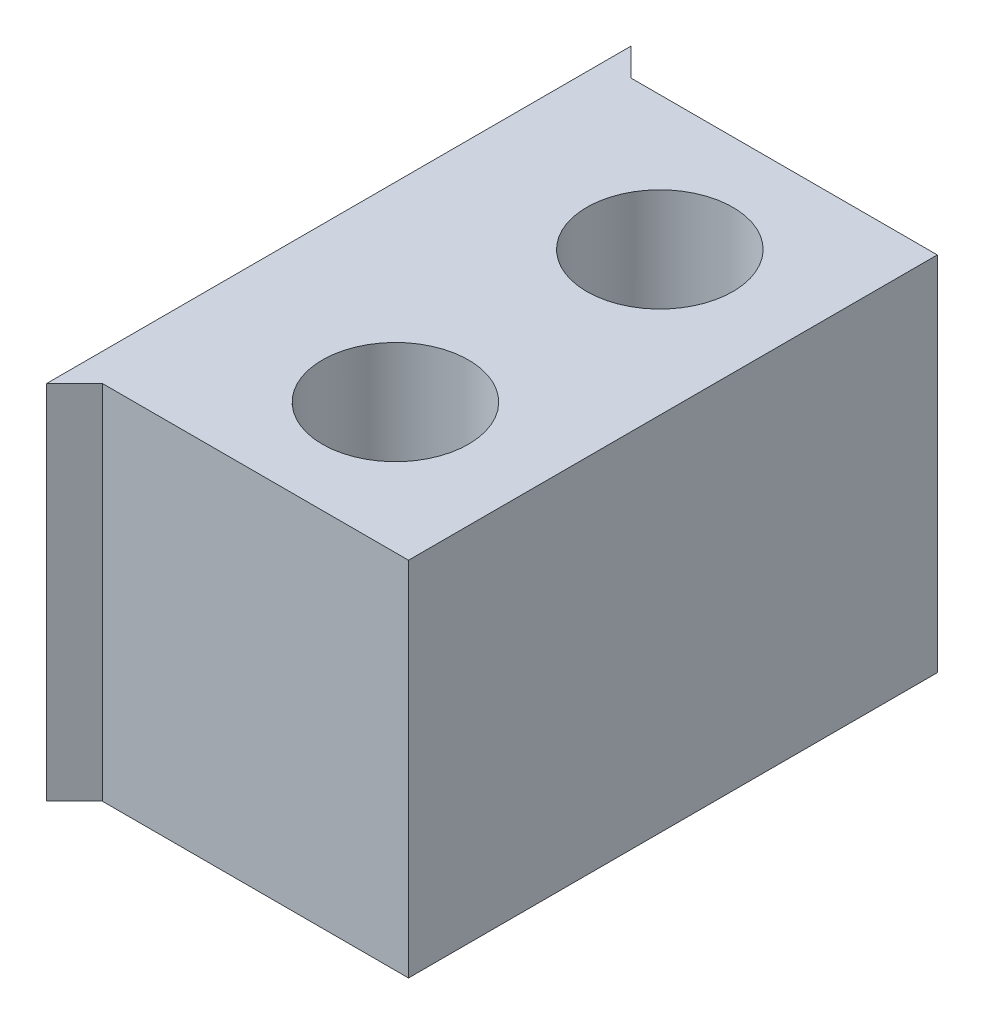
ISO-10303-21;
HEADER;
FILE_DESCRIPTION(('STEP AP214'),'2;1');
FILE_NAME('part.step','',(''),(''),'','','');
FILE_SCHEMA(('AUTOMOTIVE_DESIGN { 1 0 10303 214 1 1 1 1 }'));
ENDSEC;
DATA;
#1=APPLICATION_CONTEXT('core data for automotive mechanical design processes');
#2=APPLICATION_PROTOCOL_DEFINITION('international standard','automotive_design',2000,#1);
#3=PRODUCT_CONTEXT('',#1,'mechanical');
#4=PRODUCT('Part','Part','',(#3));
#5=PRODUCT_RELATED_PRODUCT_CATEGORY('part','',(#4));
#6=PRODUCT_DEFINITION_FORMATION('','',#4);
#7=PRODUCT_DEFINITION_CONTEXT('part definition',#1,'design');
#8=PRODUCT_DEFINITION('design','',#6,#7);
#9=PRODUCT_DEFINITION_SHAPE('','',#8);
#10=(LENGTH_UNIT() NAMED_UNIT(*) SI_UNIT(.MILLI.,.METRE.));
#11=(NAMED_UNIT(*) PLANE_ANGLE_UNIT() SI_UNIT($,.RADIAN.));
#12=(NAMED_UNIT(*) SI_UNIT($,.STERADIAN.) SOLID_ANGLE_UNIT());
#13=UNCERTAINTY_MEASURE_WITH_UNIT(LENGTH_MEASURE(1.E-05),#10,'distance_accuracy_value','');
#14=(GEOMETRIC_REPRESENTATION_CONTEXT(3) GLOBAL_UNCERTAINTY_ASSIGNED_CONTEXT((#13)) GLOBAL_UNIT_ASSIGNED_CONTEXT((#10,
#11,#12)) REPRESENTATION_CONTEXT('',''));
#15=CARTESIAN_POINT('',(0.,0.,0.));
#16=DIRECTION('',(0.,0.,1.));
#17=DIRECTION('',(1.,0.,0.));
#18=AXIS2_PLACEMENT_3D('',#15,#16,#17);
#19=CARTESIAN_POINT('',(52.,0.,0.));
#20=DIRECTION('',(1.,0.,0.));
#21=DIRECTION('',(0.,0.,-1.));
#22=AXIS2_PLACEMENT_3D('',#19,#20,#21);
#23=PLANE('',#22);
#24=DIRECTION('',(0.,0.,1.));
#25=VECTOR('',#24,1.);
#26=CARTESIAN_POINT('',(52.,-50.,0.));
#27=LINE('',#26,#25);
#28=CARTESIAN_POINT('',(52.,-50.,34.0000000000002));
#29=VERTEX_POINT('',#28);
#30=CARTESIAN_POINT('',(52.,-50.,76.0000000000002));
#31=VERTEX_POINT('',#30);
#32=EDGE_CURVE('E39',#29,#31,#27,.T.);
#33=ORIENTED_EDGE('',*,*,#32,.T.);
#34=DIRECTION('',(0.,1.,0.));
#35=VECTOR('',#34,1.);
#36=CARTESIAN_POINT('',(52.,-20.,76.0000000000002));
#37=LINE('',#36,#35);
#38=CARTESIAN_POINT('',(52.,-24.,76.0000000000002));
#39=VERTEX_POINT('',#38);
#40=EDGE_CURVE('E44',#31,#39,#37,.T.);
#41=ORIENTED_EDGE('',*,*,#40,.T.);
#42=DIRECTION('',(0.,0.,1.));
#43=VECTOR('',#42,1.);
#44=CARTESIAN_POINT('',(52.,-24.,34.0000000000002));
#45=LINE('',#44,#43);
#46=CARTESIAN_POINT('',(52.,-24.,34.0000000000002));
#47=VERTEX_POINT('',#46);
#48=EDGE_CURVE('E111',#47,#39,#45,.T.);
#49=ORIENTED_EDGE('',*,*,#48,.F.);
#50=DIRECTION('',(0.,-1.,0.));
#51=VECTOR('',#50,1.);
#52=CARTESIAN_POINT('',(52.,-50.,34.0000000000002));
#53=LINE('',#52,#51);
#54=EDGE_CURVE('E11',#47,#29,#53,.T.);
#55=ORIENTED_EDGE('',*,*,#54,.T.);
#56=EDGE_LOOP('',(#33,#41,#49,#55));
#57=FACE_BOUND('',#56,.T.);
#58=ADVANCED_FACE('F36',(#57),#23,.F.);
#59=CARTESIAN_POINT('',(0.,-50.,0.));
#60=DIRECTION('',(0.,-1.,0.));
#61=DIRECTION('',(0.,0.,-1.));
#62=AXIS2_PLACEMENT_3D('',#59,#60,#61);
#63=PLANE('',#62);
#64=ORIENTED_EDGE('',*,*,#32,.F.);
#65=DIRECTION('',(-0.707106781186548,0.,-0.707106781186548));
#66=VECTOR('',#65,1.);
#67=CARTESIAN_POINT('',(63.9999999999999,-50.,46.0000000000001));
#68=LINE('',#67,#66);
#69=CARTESIAN_POINT('',(54.,-50.,36.0000000000002));
#70=VERTEX_POINT('',#69);
#71=EDGE_CURVE('E97',#29,#70,#68,.F.);
#72=ORIENTED_EDGE('',*,*,#71,.T.);
#73=DIRECTION('',(1.,0.,0.));
#74=VECTOR('',#73,1.);
#75=CARTESIAN_POINT('',(81.,-50.,36.0000000000002));
#76=LINE('',#75,#74);
#77=CARTESIAN_POINT('',(76.,-50.,36.0000000000002));
#78=VERTEX_POINT('',#77);
#79=EDGE_CURVE('E134',#70,#78,#76,.T.);
#80=ORIENTED_EDGE('',*,*,#79,.T.);
#81=DIRECTION('',(0.,0.,1.));
#82=VECTOR('',#81,1.);
#83=CARTESIAN_POINT('',(76.,-50.,36.0000000000002));
#84=LINE('',#83,#82);
#85=CARTESIAN_POINT('',(76.,-50.,74.0000000000002));
#86=VERTEX_POINT('',#85);
#87=EDGE_CURVE('E126',#78,#86,#84,.T.);
#88=ORIENTED_EDGE('',*,*,#87,.T.);
#89=DIRECTION('',(-1.,0.,0.));
#90=VECTOR('',#89,1.);
#91=CARTESIAN_POINT('',(81.,-50.,74.0000000000002));
#92=LINE('',#91,#90);
#93=CARTESIAN_POINT('',(54.,-50.,74.0000000000002));
#94=VERTEX_POINT('',#93);
#95=EDGE_CURVE('E128',#86,#94,#92,.T.);
#96=ORIENTED_EDGE('',*,*,#95,.T.);
#97=DIRECTION('',(0.707106781186538,0.,-0.707106781186557));
#98=VECTOR('',#97,1.);
#99=CARTESIAN_POINT('',(9.00000000000083,-50.,119.000000000001));
#100=LINE('',#99,#98);
#101=EDGE_CURVE('E92',#94,#31,#100,.F.);
#102=ORIENTED_EDGE('',*,*,#101,.T.);
#103=EDGE_LOOP('',(#64,#72,#80,#88,#96,#102));
#104=FACE_BOUND('',#103,.T.);
#105=CARTESIAN_POINT('',(65.69,-50.,45.6300000000002));
#106=DIRECTION('',(0.,-1.,0.));
#107=DIRECTION('',(0.,0.,-1.));
#108=AXIS2_PLACEMENT_3D('',#105,#106,#107);
#109=CIRCLE('',#108,5.25);
#110=CARTESIAN_POINT('',(65.69,-50.,40.3800000000002));
#111=VERTEX_POINT('',#110);
#112=EDGE_CURVE('E137',#111,#111,#109,.F.);
#113=ORIENTED_EDGE('',*,*,#112,.T.);
#114=EDGE_LOOP('',(#113));
#115=FACE_BOUND('',#114,.T.);
#116=CARTESIAN_POINT('',(65.69,-50.,64.6300000000002));
#117=DIRECTION('',(0.,-1.,0.));
#118=DIRECTION('',(0.,0.,-1.));
#119=AXIS2_PLACEMENT_3D('',#116,#117,#118);
#120=CIRCLE('',#119,5.25);
#121=CARTESIAN_POINT('',(65.69,-50.,59.3800000000002));
#122=VERTEX_POINT('',#121);
#123=EDGE_CURVE('E140',#122,#122,#120,.F.);
#124=ORIENTED_EDGE('',*,*,#123,.T.);
#125=EDGE_LOOP('',(#124));
#126=FACE_BOUND('',#125,.T.);
#127=ADVANCED_FACE('F150',(#104,#115,#126),#63,.T.);
#128=CARTESIAN_POINT('',(65.69,-47.,64.6300000000002));
#129=DIRECTION('',(0.,1.,0.));
#130=DIRECTION('',(0.,0.,1.));
#131=AXIS2_PLACEMENT_3D('',#128,#129,#130);
#132=CYLINDRICAL_SURFACE('',#131,5.25);
#133=ORIENTED_EDGE('',*,*,#123,.F.);
#134=EDGE_LOOP('',(#133));
#135=FACE_BOUND('',#134,.T.);
#136=CARTESIAN_POINT('',(65.69,-24.,64.6300000000002));
#137=DIRECTION('',(0.,1.,0.));
#138=DIRECTION('',(0.,0.,1.));
#139=AXIS2_PLACEMENT_3D('',#136,#137,#138);
#140=CIRCLE('',#139,5.25);
#141=CARTESIAN_POINT('',(65.69,-24.,69.8800000000002));
#142=VERTEX_POINT('',#141);
#143=EDGE_CURVE('E115',#142,#142,#140,.T.);
#144=ORIENTED_EDGE('',*,*,#143,.T.);
#145=EDGE_LOOP('',(#144));
#146=FACE_BOUND('',#145,.T.);
#147=ADVANCED_FACE('F161',(#135,#146),#132,.F.);
#148=CARTESIAN_POINT('',(54.,-211.81128696562,36.0000000000002));
#149=DIRECTION('',(0.707106781186547,0.,-0.707106781186547));
#150=DIRECTION('',(0.,-1.,0.));
#151=AXIS2_PLACEMENT_3D('',#148,#149,#150);
#152=PLANE('',#151);
#153=ORIENTED_EDGE('',*,*,#54,.F.);
#154=DIRECTION('',(-0.707106781186547,0.,-0.707106781186547));
#155=VECTOR('',#154,1.);
#156=CARTESIAN_POINT('',(54.,-24.,36.0000000000002));
#157=LINE('',#156,#155);
#158=CARTESIAN_POINT('',(54.,-24.,36.0000000000002));
#159=VERTEX_POINT('',#158);
#160=EDGE_CURVE('E123',#159,#47,#157,.T.);
#161=ORIENTED_EDGE('',*,*,#160,.F.);
#162=DIRECTION('',(0.,1.,0.));
#163=VECTOR('',#162,1.);
#164=CARTESIAN_POINT('',(54.,-20.,36.0000000000002));
#165=LINE('',#164,#163);
#166=EDGE_CURVE('E96',#70,#159,#165,.T.);
#167=ORIENTED_EDGE('',*,*,#166,.F.);
#168=ORIENTED_EDGE('',*,*,#71,.F.);
#169=EDGE_LOOP('',(#153,#161,#167,#168));
#170=FACE_BOUND('',#169,.T.);
#171=ADVANCED_FACE('F159',(#170),#152,.T.);
#172=CARTESIAN_POINT('',(81.,-211.81128696562,36.0000000000002));
#173=DIRECTION('',(0.,0.,1.));
#174=DIRECTION('',(1.,0.,0.));
#175=AXIS2_PLACEMENT_3D('',#172,#173,#174);
#176=PLANE('',#175);
#177=ORIENTED_EDGE('',*,*,#79,.F.);
#178=ORIENTED_EDGE('',*,*,#166,.T.);
#179=DIRECTION('',(-1.,0.,0.));
#180=VECTOR('',#179,1.);
#181=CARTESIAN_POINT('',(76.,-24.,36.0000000000002));
#182=LINE('',#181,#180);
#183=CARTESIAN_POINT('',(76.,-24.,36.0000000000002));
#184=VERTEX_POINT('',#183);
#185=EDGE_CURVE('E120',#184,#159,#182,.T.);
#186=ORIENTED_EDGE('',*,*,#185,.F.);
#187=DIRECTION('',(0.,1.,0.));
#188=VECTOR('',#187,1.);
#189=CARTESIAN_POINT('',(76.,-188.,36.0000000000002));
#190=LINE('',#189,#188);
#191=EDGE_CURVE('E145',#78,#184,#190,.T.);
#192=ORIENTED_EDGE('',*,*,#191,.F.);
#193=EDGE_LOOP('',(#177,#178,#186,#192));
#194=FACE_BOUND('',#193,.T.);
#195=ADVANCED_FACE('F157',(#194),#176,.F.);
#196=CARTESIAN_POINT('',(76.,-188.,36.0000000000002));
#197=DIRECTION('',(-1.,0.,0.));
#198=DIRECTION('',(0.,0.,1.));
#199=AXIS2_PLACEMENT_3D('',#196,#197,#198);
#200=PLANE('',#199);
#201=ORIENTED_EDGE('',*,*,#87,.F.);
#202=ORIENTED_EDGE('',*,*,#191,.T.);
#203=DIRECTION('',(0.,0.,-1.));
#204=VECTOR('',#203,1.);
#205=CARTESIAN_POINT('',(76.,-24.,74.0000000000002));
#206=LINE('',#205,#204);
#207=CARTESIAN_POINT('',(76.,-24.,74.0000000000002));
#208=VERTEX_POINT('',#207);
#209=EDGE_CURVE('E106',#208,#184,#206,.T.);
#210=ORIENTED_EDGE('',*,*,#209,.F.);
#211=DIRECTION('',(0.,1.,0.));
#212=VECTOR('',#211,1.);
#213=CARTESIAN_POINT('',(76.,-188.,74.0000000000002));
#214=LINE('',#213,#212);
#215=EDGE_CURVE('E102',#86,#208,#214,.T.);
#216=ORIENTED_EDGE('',*,*,#215,.F.);
#217=EDGE_LOOP('',(#201,#202,#210,#216));
#218=FACE_BOUND('',#217,.T.);
#219=ADVANCED_FACE('F153',(#218),#200,.F.);
#220=CARTESIAN_POINT('',(81.,-211.81128696562,74.0000000000002));
#221=DIRECTION('',(0.,0.,-1.));
#222=DIRECTION('',(-1.,0.,0.));
#223=AXIS2_PLACEMENT_3D('',#220,#221,#222);
#224=PLANE('',#223);
#225=ORIENTED_EDGE('',*,*,#95,.F.);
#226=ORIENTED_EDGE('',*,*,#215,.T.);
#227=DIRECTION('',(1.,0.,0.));
#228=VECTOR('',#227,1.);
#229=CARTESIAN_POINT('',(54.,-24.,74.0000000000002));
#230=LINE('',#229,#228);
#231=CARTESIAN_POINT('',(54.,-24.,74.0000000000002));
#232=VERTEX_POINT('',#231);
#233=EDGE_CURVE('E100',#232,#208,#230,.T.);
#234=ORIENTED_EDGE('',*,*,#233,.F.);
#235=DIRECTION('',(0.,-1.,0.));
#236=VECTOR('',#235,1.);
#237=CARTESIAN_POINT('',(54.,-50.,74.0000000000002));
#238=LINE('',#237,#236);
#239=EDGE_CURVE('E86',#232,#94,#238,.T.);
#240=ORIENTED_EDGE('',*,*,#239,.T.);
#241=EDGE_LOOP('',(#225,#226,#234,#240));
#242=FACE_BOUND('',#241,.T.);
#243=ADVANCED_FACE('F101',(#242),#224,.F.);
#244=CARTESIAN_POINT('',(52.,-188.,76.0000000000002));
#245=DIRECTION('',(0.707106781186557,0.,0.707106781186538));
#246=DIRECTION('',(0.,-1.,0.));
#247=AXIS2_PLACEMENT_3D('',#244,#245,#246);
#248=PLANE('',#247);
#249=ORIENTED_EDGE('',*,*,#239,.F.);
#250=DIRECTION('',(0.707106781186538,0.,-0.707106781186557));
#251=VECTOR('',#250,1.);
#252=CARTESIAN_POINT('',(52.,-24.,76.0000000000002));
#253=LINE('',#252,#251);
#254=EDGE_CURVE('E90',#39,#232,#253,.T.);
#255=ORIENTED_EDGE('',*,*,#254,.F.);
#256=ORIENTED_EDGE('',*,*,#40,.F.);
#257=ORIENTED_EDGE('',*,*,#101,.F.);
#258=EDGE_LOOP('',(#249,#255,#256,#257));
#259=FACE_BOUND('',#258,.T.);
#260=ADVANCED_FACE('F88',(#259),#248,.T.);
#261=CARTESIAN_POINT('',(65.69,-47.,45.6300000000002));
#262=DIRECTION('',(0.,1.,0.));
#263=DIRECTION('',(0.,0.,1.));
#264=AXIS2_PLACEMENT_3D('',#261,#262,#263);
#265=CYLINDRICAL_SURFACE('',#264,5.25);
#266=ORIENTED_EDGE('',*,*,#112,.F.);
#267=EDGE_LOOP('',(#266));
#268=FACE_BOUND('',#267,.T.);
#269=CARTESIAN_POINT('',(65.69,-24.,45.6300000000002));
#270=DIRECTION('',(0.,1.,0.));
#271=DIRECTION('',(0.,0.,1.));
#272=AXIS2_PLACEMENT_3D('',#269,#270,#271);
#273=CIRCLE('',#272,5.25);
#274=CARTESIAN_POINT('',(65.69,-24.,50.8800000000002));
#275=VERTEX_POINT('',#274);
#276=EDGE_CURVE('E112',#275,#275,#273,.T.);
#277=ORIENTED_EDGE('',*,*,#276,.T.);
#278=EDGE_LOOP('',(#277));
#279=FACE_BOUND('',#278,.T.);
#280=ADVANCED_FACE('F179',(#268,#279),#265,.F.);
#281=CARTESIAN_POINT('',(0.,-24.,0.));
#282=DIRECTION('',(0.,1.,0.));
#283=DIRECTION('',(0.,0.,1.));
#284=AXIS2_PLACEMENT_3D('',#281,#282,#283);
#285=PLANE('',#284);
#286=ORIENTED_EDGE('',*,*,#276,.F.);
#287=EDGE_LOOP('',(#286));
#288=FACE_BOUND('',#287,.T.);
#289=ORIENTED_EDGE('',*,*,#254,.T.);
#290=ORIENTED_EDGE('',*,*,#233,.T.);
#291=ORIENTED_EDGE('',*,*,#209,.T.);
#292=ORIENTED_EDGE('',*,*,#185,.T.);
#293=ORIENTED_EDGE('',*,*,#160,.T.);
#294=ORIENTED_EDGE('',*,*,#48,.T.);
#295=EDGE_LOOP('',(#289,#290,#291,#292,#293,#294));
#296=FACE_BOUND('',#295,.T.);
#297=ORIENTED_EDGE('',*,*,#143,.F.);
#298=EDGE_LOOP('',(#297));
#299=FACE_BOUND('',#298,.T.);
#300=ADVANCED_FACE('F108',(#288,#296,#299),#285,.T.);
#301=CLOSED_SHELL('',(#58,#127,#147,#171,#195,#219,#243,#260,#280,#300));
#302=MANIFOLD_SOLID_BREP('B2',#301);
#303=ADVANCED_BREP_SHAPE_REPRESENTATION('',(#18,#302),#14);
#304=SHAPE_DEFINITION_REPRESENTATION(#9,#303);
ENDSEC;
END-ISO-10303-21;
